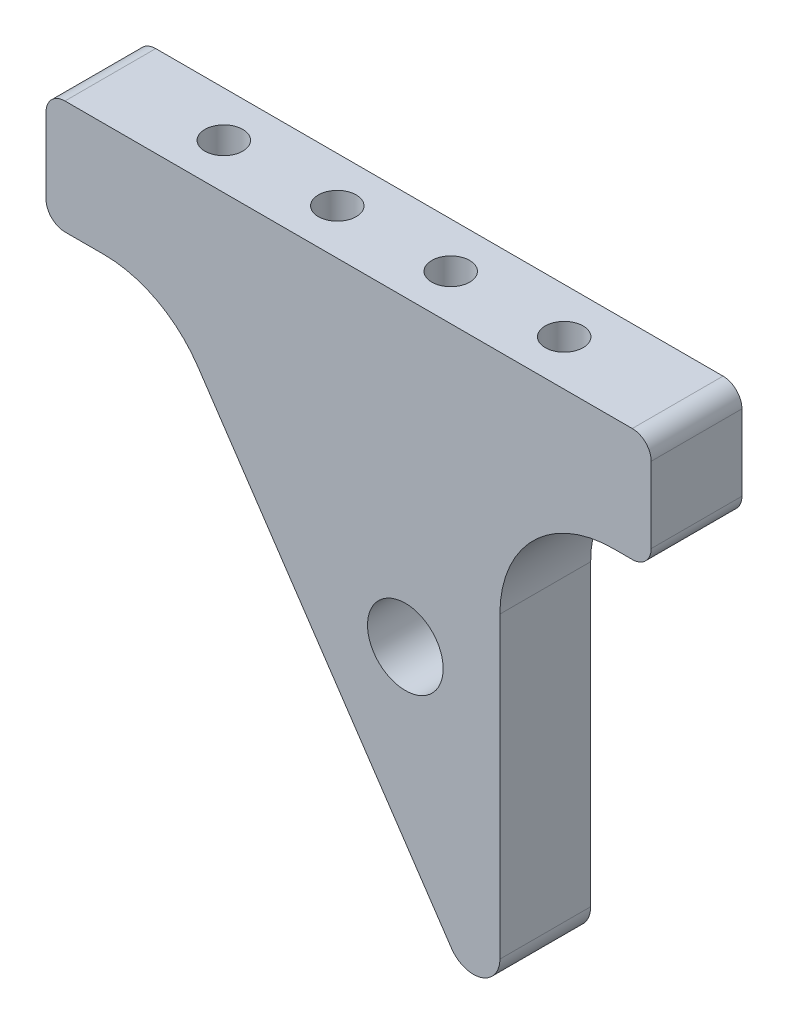
ISO-10303-21;
HEADER;
FILE_DESCRIPTION(('STEP AP214'),'2;1');
FILE_NAME('part.step','',(''),(''),'','','');
FILE_SCHEMA(('AUTOMOTIVE_DESIGN { 1 0 10303 214 1 1 1 1 }'));
ENDSEC;
DATA;
#1=APPLICATION_CONTEXT('core data for automotive mechanical design processes');
#2=APPLICATION_PROTOCOL_DEFINITION('international standard','automotive_design',2000,#1);
#3=PRODUCT_CONTEXT('',#1,'mechanical');
#4=PRODUCT('Part','Part','',(#3));
#5=PRODUCT_RELATED_PRODUCT_CATEGORY('part','',(#4));
#6=PRODUCT_DEFINITION_FORMATION('','',#4);
#7=PRODUCT_DEFINITION_CONTEXT('part definition',#1,'design');
#8=PRODUCT_DEFINITION('design','',#6,#7);
#9=PRODUCT_DEFINITION_SHAPE('','',#8);
#10=(LENGTH_UNIT() NAMED_UNIT(*) SI_UNIT(.MILLI.,.METRE.));
#11=(NAMED_UNIT(*) PLANE_ANGLE_UNIT() SI_UNIT($,.RADIAN.));
#12=(NAMED_UNIT(*) SI_UNIT($,.STERADIAN.) SOLID_ANGLE_UNIT());
#13=UNCERTAINTY_MEASURE_WITH_UNIT(LENGTH_MEASURE(1.E-05),#10,'distance_accuracy_value','');
#14=(GEOMETRIC_REPRESENTATION_CONTEXT(3) GLOBAL_UNCERTAINTY_ASSIGNED_CONTEXT((#13)) GLOBAL_UNIT_ASSIGNED_CONTEXT((#10,
#11,#12)) REPRESENTATION_CONTEXT('',''));
#15=CARTESIAN_POINT('',(0.,0.,0.));
#16=DIRECTION('',(0.,0.,1.));
#17=DIRECTION('',(1.,0.,0.));
#18=AXIS2_PLACEMENT_3D('',#15,#16,#17);
#19=CARTESIAN_POINT('',(27.5,9.99999999999991,12.));
#20=DIRECTION('',(0.,0.,1.));
#21=DIRECTION('',(1.,0.,0.));
#22=AXIS2_PLACEMENT_3D('',#19,#20,#21);
#23=PLANE('',#22);
#24=DIRECTION('',(0.,1.,0.));
#25=VECTOR('',#24,1.);
#26=CARTESIAN_POINT('',(12.5,0.,12.));
#27=LINE('',#26,#25);
#28=CARTESIAN_POINT('',(12.5,-29.5,12.));
#29=VERTEX_POINT('',#28);
#30=CARTESIAN_POINT('',(12.5,9.99999999999981,12.));
#31=VERTEX_POINT('',#30);
#32=EDGE_CURVE('E50',#29,#31,#27,.T.);
#33=ORIENTED_EDGE('',*,*,#32,.T.);
#34=CARTESIAN_POINT('',(27.5,9.99999999999991,12.));
#35=DIRECTION('',(0.,0.,-1.));
#36=DIRECTION('',(1.,0.,0.));
#37=AXIS2_PLACEMENT_3D('',#34,#35,#36);
#38=CIRCLE('',#37,15.);
#39=CARTESIAN_POINT('',(27.5000000000001,24.9999999999999,12.));
#40=VERTEX_POINT('',#39);
#41=EDGE_CURVE('E111',#31,#40,#38,.T.);
#42=ORIENTED_EDGE('',*,*,#41,.T.);
#43=DIRECTION('',(1.,0.,0.));
#44=VECTOR('',#43,1.);
#45=CARTESIAN_POINT('',(30.,24.9999999999999,12.));
#46=LINE('',#45,#44);
#47=CARTESIAN_POINT('',(30.,24.9999999999999,12.));
#48=VERTEX_POINT('',#47);
#49=EDGE_CURVE('E228',#40,#48,#46,.T.);
#50=ORIENTED_EDGE('',*,*,#49,.T.);
#51=CARTESIAN_POINT('',(30.,27.4999999999999,12.));
#52=DIRECTION('',(0.,0.,1.));
#53=DIRECTION('',(-1.,0.,0.));
#54=AXIS2_PLACEMENT_3D('',#51,#52,#53);
#55=CIRCLE('',#54,2.5);
#56=CARTESIAN_POINT('',(32.5,27.4999999999999,12.));
#57=VERTEX_POINT('',#56);
#58=EDGE_CURVE('E248',#48,#57,#55,.T.);
#59=ORIENTED_EDGE('',*,*,#58,.T.);
#60=DIRECTION('',(0.,1.,0.));
#61=VECTOR('',#60,1.);
#62=CARTESIAN_POINT('',(32.5,37.4999999999999,12.));
#63=LINE('',#62,#61);
#64=CARTESIAN_POINT('',(32.5,37.4999999999999,12.));
#65=VERTEX_POINT('',#64);
#66=EDGE_CURVE('E245',#57,#65,#63,.T.);
#67=ORIENTED_EDGE('',*,*,#66,.T.);
#68=CARTESIAN_POINT('',(30.,37.4999999999999,12.));
#69=DIRECTION('',(0.,0.,1.));
#70=DIRECTION('',(-1.,0.,0.));
#71=AXIS2_PLACEMENT_3D('',#68,#69,#70);
#72=CIRCLE('',#71,2.5);
#73=CARTESIAN_POINT('',(30.,39.9999999999999,12.));
#74=VERTEX_POINT('',#73);
#75=EDGE_CURVE('E247',#65,#74,#72,.T.);
#76=ORIENTED_EDGE('',*,*,#75,.T.);
#77=DIRECTION('',(-1.,0.,0.));
#78=VECTOR('',#77,1.);
#79=CARTESIAN_POINT('',(-45.,39.9999999999999,12.));
#80=LINE('',#79,#78);
#81=CARTESIAN_POINT('',(-45.,39.9999999999999,12.));
#82=VERTEX_POINT('',#81);
#83=EDGE_CURVE('E250',#74,#82,#80,.T.);
#84=ORIENTED_EDGE('',*,*,#83,.T.);
#85=CARTESIAN_POINT('',(-45.,37.4999999999999,12.));
#86=DIRECTION('',(0.,0.,1.));
#87=DIRECTION('',(1.,0.,0.));
#88=AXIS2_PLACEMENT_3D('',#85,#86,#87);
#89=CIRCLE('',#88,2.50000000000001);
#90=CARTESIAN_POINT('',(-47.5,37.4999999999999,12.));
#91=VERTEX_POINT('',#90);
#92=EDGE_CURVE('E256',#82,#91,#89,.T.);
#93=ORIENTED_EDGE('',*,*,#92,.T.);
#94=DIRECTION('',(0.,-1.,0.));
#95=VECTOR('',#94,1.);
#96=CARTESIAN_POINT('',(-47.5,27.4999999999999,12.));
#97=LINE('',#96,#95);
#98=CARTESIAN_POINT('',(-47.5,27.4999999999999,12.));
#99=VERTEX_POINT('',#98);
#100=EDGE_CURVE('E258',#91,#99,#97,.T.);
#101=ORIENTED_EDGE('',*,*,#100,.T.);
#102=CARTESIAN_POINT('',(-45.,27.4999999999999,12.));
#103=DIRECTION('',(0.,0.,1.));
#104=DIRECTION('',(-1.,0.,0.));
#105=AXIS2_PLACEMENT_3D('',#102,#103,#104);
#106=CIRCLE('',#105,2.5);
#107=CARTESIAN_POINT('',(-45.,24.9999999999999,12.));
#108=VERTEX_POINT('',#107);
#109=EDGE_CURVE('E260',#99,#108,#106,.T.);
#110=ORIENTED_EDGE('',*,*,#109,.T.);
#111=DIRECTION('',(1.,0.,0.));
#112=VECTOR('',#111,1.);
#113=CARTESIAN_POINT('',(-39.8725055432373,24.9999999999999,12.));
#114=LINE('',#113,#112);
#115=CARTESIAN_POINT('',(-39.8725055432373,24.9999999999999,12.));
#116=VERTEX_POINT('',#115);
#117=EDGE_CURVE('E149',#108,#116,#114,.T.);
#118=ORIENTED_EDGE('',*,*,#117,.T.);
#119=CARTESIAN_POINT('',(-39.8725055432372,9.99999999999991,12.));
#120=DIRECTION('',(0.,0.,-1.));
#121=DIRECTION('',(-1.,0.,0.));
#122=AXIS2_PLACEMENT_3D('',#119,#120,#121);
#123=CIRCLE('',#122,15.);
#124=CARTESIAN_POINT('',(-27.4270390517785,18.3731931668855,12.));
#125=VERTEX_POINT('',#124);
#126=EDGE_CURVE('E143',#116,#125,#123,.T.);
#127=ORIENTED_EDGE('',*,*,#126,.T.);
#128=DIRECTION('',(0.558212877792378,-0.82969776609724,0.));
#129=VECTOR('',#128,1.);
#130=CARTESIAN_POINT('',(-27.4270390517785,18.3731931668855,12.));
#131=LINE('',#130,#129);
#132=CARTESIAN_POINT('',(6.09605781865966,-31.4537450722733,12.));
#133=VERTEX_POINT('',#132);
#134=EDGE_CURVE('E147',#125,#133,#131,.T.);
#135=ORIENTED_EDGE('',*,*,#134,.T.);
#136=CARTESIAN_POINT('',(9.00000000000001,-29.5,12.));
#137=DIRECTION('',(0.,0.,1.));
#138=DIRECTION('',(-1.,0.,0.));
#139=AXIS2_PLACEMENT_3D('',#136,#137,#138);
#140=CIRCLE('',#139,3.5);
#141=EDGE_CURVE('E164',#133,#29,#140,.T.);
#142=ORIENTED_EDGE('',*,*,#141,.T.);
#143=EDGE_LOOP('',(#33,#42,#50,#59,#67,#76,#84,#93,#101,#110,#118,#127,#135,#142));
#144=FACE_BOUND('',#143,.T.);
#145=CARTESIAN_POINT('',(0.,0.,12.));
#146=DIRECTION('',(0.,0.,1.));
#147=DIRECTION('',(1.,0.,0.));
#148=AXIS2_PLACEMENT_3D('',#145,#146,#147);
#149=CIRCLE('',#148,5.);
#150=CARTESIAN_POINT('',(5.,0.,12.));
#151=VERTEX_POINT('',#150);
#152=EDGE_CURVE('E173',#151,#151,#149,.T.);
#153=ORIENTED_EDGE('',*,*,#152,.F.);
#154=EDGE_LOOP('',(#153));
#155=FACE_BOUND('',#154,.T.);
#156=ADVANCED_FACE('F33',(#144,#155),#23,.T.);
#157=CARTESIAN_POINT('',(27.5,9.99999999999991,0.));
#158=DIRECTION('',(0.,0.,1.));
#159=DIRECTION('',(1.,0.,0.));
#160=AXIS2_PLACEMENT_3D('',#157,#158,#159);
#161=PLANE('',#160);
#162=CARTESIAN_POINT('',(27.5,9.99999999999991,0.));
#163=DIRECTION('',(0.,0.,-1.));
#164=DIRECTION('',(1.,0.,0.));
#165=AXIS2_PLACEMENT_3D('',#162,#163,#164);
#166=CIRCLE('',#165,15.);
#167=CARTESIAN_POINT('',(12.5,9.99999999999981,0.));
#168=VERTEX_POINT('',#167);
#169=CARTESIAN_POINT('',(27.5000000000001,24.9999999999999,0.));
#170=VERTEX_POINT('',#169);
#171=EDGE_CURVE('E170',#168,#170,#166,.T.);
#172=ORIENTED_EDGE('',*,*,#171,.F.);
#173=DIRECTION('',(0.,1.,0.));
#174=VECTOR('',#173,1.);
#175=CARTESIAN_POINT('',(12.5,0.,0.));
#176=LINE('',#175,#174);
#177=CARTESIAN_POINT('',(12.5,-29.5,0.));
#178=VERTEX_POINT('',#177);
#179=EDGE_CURVE('E194',#178,#168,#176,.T.);
#180=ORIENTED_EDGE('',*,*,#179,.F.);
#181=CARTESIAN_POINT('',(9.00000000000001,-29.5,0.));
#182=DIRECTION('',(0.,0.,1.));
#183=DIRECTION('',(-1.,0.,0.));
#184=AXIS2_PLACEMENT_3D('',#181,#182,#183);
#185=CIRCLE('',#184,3.5);
#186=CARTESIAN_POINT('',(6.09605781865966,-31.4537450722733,0.));
#187=VERTEX_POINT('',#186);
#188=EDGE_CURVE('E104',#187,#178,#185,.T.);
#189=ORIENTED_EDGE('',*,*,#188,.F.);
#190=DIRECTION('',(0.558212877792379,-0.82969776609724,0.));
#191=VECTOR('',#190,1.);
#192=CARTESIAN_POINT('',(-10.3712220762155,-6.97766097240473,0.));
#193=LINE('',#192,#191);
#194=CARTESIAN_POINT('',(-27.4270390517785,18.3731931668855,0.));
#195=VERTEX_POINT('',#194);
#196=EDGE_CURVE('E97',#195,#187,#193,.T.);
#197=ORIENTED_EDGE('',*,*,#196,.F.);
#198=CARTESIAN_POINT('',(-39.8725055432372,9.99999999999991,0.));
#199=DIRECTION('',(0.,0.,-1.));
#200=DIRECTION('',(-1.,0.,0.));
#201=AXIS2_PLACEMENT_3D('',#198,#199,#200);
#202=CIRCLE('',#201,15.);
#203=CARTESIAN_POINT('',(-39.8725055432373,24.9999999999999,0.));
#204=VERTEX_POINT('',#203);
#205=EDGE_CURVE('E158',#204,#195,#202,.T.);
#206=ORIENTED_EDGE('',*,*,#205,.F.);
#207=DIRECTION('',(1.,0.,0.));
#208=VECTOR('',#207,1.);
#209=CARTESIAN_POINT('',(-39.8725055432373,24.9999999999999,0.));
#210=LINE('',#209,#208);
#211=CARTESIAN_POINT('',(-45.,24.9999999999999,0.));
#212=VERTEX_POINT('',#211);
#213=EDGE_CURVE('E189',#212,#204,#210,.T.);
#214=ORIENTED_EDGE('',*,*,#213,.F.);
#215=CARTESIAN_POINT('',(-45.,27.4999999999999,0.));
#216=DIRECTION('',(0.,0.,1.));
#217=DIRECTION('',(-1.,0.,0.));
#218=AXIS2_PLACEMENT_3D('',#215,#216,#217);
#219=CIRCLE('',#218,2.5);
#220=CARTESIAN_POINT('',(-47.5,27.4999999999999,0.));
#221=VERTEX_POINT('',#220);
#222=EDGE_CURVE('E187',#221,#212,#219,.T.);
#223=ORIENTED_EDGE('',*,*,#222,.F.);
#224=DIRECTION('',(0.,-1.,0.));
#225=VECTOR('',#224,1.);
#226=CARTESIAN_POINT('',(-47.5,27.4999999999999,0.));
#227=LINE('',#226,#225);
#228=CARTESIAN_POINT('',(-47.5,37.4999999999999,0.));
#229=VERTEX_POINT('',#228);
#230=EDGE_CURVE('E185',#229,#221,#227,.T.);
#231=ORIENTED_EDGE('',*,*,#230,.F.);
#232=CARTESIAN_POINT('',(-45.,37.4999999999999,0.));
#233=DIRECTION('',(0.,0.,1.));
#234=DIRECTION('',(1.,0.,0.));
#235=AXIS2_PLACEMENT_3D('',#232,#233,#234);
#236=CIRCLE('',#235,2.50000000000001);
#237=CARTESIAN_POINT('',(-45.,39.9999999999999,0.));
#238=VERTEX_POINT('',#237);
#239=EDGE_CURVE('E183',#238,#229,#236,.T.);
#240=ORIENTED_EDGE('',*,*,#239,.F.);
#241=DIRECTION('',(-1.,0.,0.));
#242=VECTOR('',#241,1.);
#243=CARTESIAN_POINT('',(-45.,39.9999999999999,0.));
#244=LINE('',#243,#242);
#245=CARTESIAN_POINT('',(30.,39.9999999999999,0.));
#246=VERTEX_POINT('',#245);
#247=EDGE_CURVE('E181',#246,#238,#244,.T.);
#248=ORIENTED_EDGE('',*,*,#247,.F.);
#249=CARTESIAN_POINT('',(30.,37.4999999999999,0.));
#250=DIRECTION('',(0.,0.,1.));
#251=DIRECTION('',(-1.,0.,0.));
#252=AXIS2_PLACEMENT_3D('',#249,#250,#251);
#253=CIRCLE('',#252,2.5);
#254=CARTESIAN_POINT('',(32.5,37.4999999999999,0.));
#255=VERTEX_POINT('',#254);
#256=EDGE_CURVE('E179',#255,#246,#253,.T.);
#257=ORIENTED_EDGE('',*,*,#256,.F.);
#258=DIRECTION('',(0.,1.,0.));
#259=VECTOR('',#258,1.);
#260=CARTESIAN_POINT('',(32.5,37.4999999999999,0.));
#261=LINE('',#260,#259);
#262=CARTESIAN_POINT('',(32.5,27.4999999999999,0.));
#263=VERTEX_POINT('',#262);
#264=EDGE_CURVE('E177',#263,#255,#261,.T.);
#265=ORIENTED_EDGE('',*,*,#264,.F.);
#266=CARTESIAN_POINT('',(30.,27.4999999999999,0.));
#267=DIRECTION('',(0.,0.,1.));
#268=DIRECTION('',(-1.,0.,0.));
#269=AXIS2_PLACEMENT_3D('',#266,#267,#268);
#270=CIRCLE('',#269,2.5);
#271=CARTESIAN_POINT('',(30.,24.9999999999999,0.));
#272=VERTEX_POINT('',#271);
#273=EDGE_CURVE('E175',#272,#263,#270,.T.);
#274=ORIENTED_EDGE('',*,*,#273,.F.);
#275=DIRECTION('',(1.,0.,0.));
#276=VECTOR('',#275,1.);
#277=CARTESIAN_POINT('',(30.,24.9999999999999,0.));
#278=LINE('',#277,#276);
#279=EDGE_CURVE('E172',#170,#272,#278,.T.);
#280=ORIENTED_EDGE('',*,*,#279,.F.);
#281=EDGE_LOOP('',(#172,#180,#189,#197,#206,#214,#223,#231,#240,#248,#257,#265,#274,#280));
#282=FACE_BOUND('',#281,.T.);
#283=CARTESIAN_POINT('',(0.,0.,0.));
#284=DIRECTION('',(0.,0.,1.));
#285=DIRECTION('',(1.,0.,0.));
#286=AXIS2_PLACEMENT_3D('',#283,#284,#285);
#287=CIRCLE('',#286,5.);
#288=CARTESIAN_POINT('',(5.,0.,0.));
#289=VERTEX_POINT('',#288);
#290=EDGE_CURVE('E276',#289,#289,#287,.T.);
#291=ORIENTED_EDGE('',*,*,#290,.T.);
#292=EDGE_LOOP('',(#291));
#293=FACE_BOUND('',#292,.T.);
#294=ADVANCED_FACE('F232',(#282,#293),#161,.F.);
#295=CARTESIAN_POINT('',(27.5,9.99999999999991,12.));
#296=DIRECTION('',(0.,0.,-1.));
#297=DIRECTION('',(-1.,0.,0.));
#298=AXIS2_PLACEMENT_3D('',#295,#296,#297);
#299=CYLINDRICAL_SURFACE('',#298,15.);
#300=ORIENTED_EDGE('',*,*,#171,.T.);
#301=DIRECTION('',(0.,0.,-1.));
#302=VECTOR('',#301,1.);
#303=CARTESIAN_POINT('',(27.5000000000001,24.9999999999999,12.));
#304=LINE('',#303,#302);
#305=EDGE_CURVE('E42',#40,#170,#304,.T.);
#306=ORIENTED_EDGE('',*,*,#305,.F.);
#307=ORIENTED_EDGE('',*,*,#41,.F.);
#308=DIRECTION('',(0.,0.,-1.));
#309=VECTOR('',#308,1.);
#310=CARTESIAN_POINT('',(12.5,9.99999999999981,12.));
#311=LINE('',#310,#309);
#312=EDGE_CURVE('E11',#31,#168,#311,.T.);
#313=ORIENTED_EDGE('',*,*,#312,.T.);
#314=EDGE_LOOP('',(#300,#306,#307,#313));
#315=FACE_BOUND('',#314,.T.);
#316=ADVANCED_FACE('F35',(#315),#299,.F.);
#317=CARTESIAN_POINT('',(30.,24.9999999999999,12.));
#318=DIRECTION('',(0.,1.,0.));
#319=DIRECTION('',(0.,0.,1.));
#320=AXIS2_PLACEMENT_3D('',#317,#318,#319);
#321=PLANE('',#320);
#322=ORIENTED_EDGE('',*,*,#279,.T.);
#323=DIRECTION('',(0.,0.,-1.));
#324=VECTOR('',#323,1.);
#325=CARTESIAN_POINT('',(30.,24.9999999999999,12.));
#326=LINE('',#325,#324);
#327=EDGE_CURVE('E220',#48,#272,#326,.T.);
#328=ORIENTED_EDGE('',*,*,#327,.F.);
#329=ORIENTED_EDGE('',*,*,#49,.F.);
#330=ORIENTED_EDGE('',*,*,#305,.T.);
#331=EDGE_LOOP('',(#322,#328,#329,#330));
#332=FACE_BOUND('',#331,.T.);
#333=ADVANCED_FACE('F226',(#332),#321,.F.);
#334=CARTESIAN_POINT('',(30.,27.4999999999999,12.));
#335=DIRECTION('',(0.,0.,-1.));
#336=DIRECTION('',(-1.,0.,0.));
#337=AXIS2_PLACEMENT_3D('',#334,#335,#336);
#338=CYLINDRICAL_SURFACE('',#337,2.5);
#339=ORIENTED_EDGE('',*,*,#273,.T.);
#340=DIRECTION('',(0.,0.,-1.));
#341=VECTOR('',#340,1.);
#342=CARTESIAN_POINT('',(32.5,27.4999999999999,12.));
#343=LINE('',#342,#341);
#344=EDGE_CURVE('E217',#57,#263,#343,.T.);
#345=ORIENTED_EDGE('',*,*,#344,.F.);
#346=ORIENTED_EDGE('',*,*,#58,.F.);
#347=ORIENTED_EDGE('',*,*,#327,.T.);
#348=EDGE_LOOP('',(#339,#345,#346,#347));
#349=FACE_BOUND('',#348,.T.);
#350=ADVANCED_FACE('F239',(#349),#338,.T.);
#351=CARTESIAN_POINT('',(32.5,37.4999999999999,12.));
#352=DIRECTION('',(-1.,0.,0.));
#353=DIRECTION('',(0.,0.,1.));
#354=AXIS2_PLACEMENT_3D('',#351,#352,#353);
#355=PLANE('',#354);
#356=ORIENTED_EDGE('',*,*,#264,.T.);
#357=DIRECTION('',(0.,0.,-1.));
#358=VECTOR('',#357,1.);
#359=CARTESIAN_POINT('',(32.5,37.4999999999999,12.));
#360=LINE('',#359,#358);
#361=EDGE_CURVE('E214',#65,#255,#360,.T.);
#362=ORIENTED_EDGE('',*,*,#361,.F.);
#363=ORIENTED_EDGE('',*,*,#66,.F.);
#364=ORIENTED_EDGE('',*,*,#344,.T.);
#365=EDGE_LOOP('',(#356,#362,#363,#364));
#366=FACE_BOUND('',#365,.T.);
#367=ADVANCED_FACE('F243',(#366),#355,.F.);
#368=CARTESIAN_POINT('',(30.,37.4999999999999,12.));
#369=DIRECTION('',(0.,0.,-1.));
#370=DIRECTION('',(-1.,0.,0.));
#371=AXIS2_PLACEMENT_3D('',#368,#369,#370);
#372=CYLINDRICAL_SURFACE('',#371,2.5);
#373=ORIENTED_EDGE('',*,*,#256,.T.);
#374=DIRECTION('',(0.,0.,-1.));
#375=VECTOR('',#374,1.);
#376=CARTESIAN_POINT('',(30.,39.9999999999999,12.));
#377=LINE('',#376,#375);
#378=EDGE_CURVE('E211',#74,#246,#377,.T.);
#379=ORIENTED_EDGE('',*,*,#378,.F.);
#380=ORIENTED_EDGE('',*,*,#75,.F.);
#381=ORIENTED_EDGE('',*,*,#361,.T.);
#382=EDGE_LOOP('',(#373,#379,#380,#381));
#383=FACE_BOUND('',#382,.T.);
#384=ADVANCED_FACE('F319',(#383),#372,.T.);
#385=CARTESIAN_POINT('',(-45.,39.9999999999999,12.));
#386=DIRECTION('',(0.,-1.,0.));
#387=DIRECTION('',(0.,0.,-1.));
#388=AXIS2_PLACEMENT_3D('',#385,#386,#387);
#389=PLANE('',#388);
#390=CARTESIAN_POINT('',(-30.,39.9999999999999,6.));
#391=DIRECTION('',(0.,1.,0.));
#392=DIRECTION('',(0.,0.,1.));
#393=AXIS2_PLACEMENT_3D('',#390,#391,#392);
#394=CIRCLE('',#393,2.5);
#395=CARTESIAN_POINT('',(-30.,39.9999999999999,8.5));
#396=VERTEX_POINT('',#395);
#397=EDGE_CURVE('E300',#396,#396,#394,.T.);
#398=ORIENTED_EDGE('',*,*,#397,.F.);
#399=EDGE_LOOP('',(#398));
#400=FACE_BOUND('',#399,.T.);
#401=CARTESIAN_POINT('',(-15.,39.9999999999999,6.));
#402=DIRECTION('',(0.,1.,0.));
#403=DIRECTION('',(0.,0.,1.));
#404=AXIS2_PLACEMENT_3D('',#401,#402,#403);
#405=CIRCLE('',#404,2.5);
#406=CARTESIAN_POINT('',(-15.,39.9999999999999,8.5));
#407=VERTEX_POINT('',#406);
#408=EDGE_CURVE('E294',#407,#407,#405,.T.);
#409=ORIENTED_EDGE('',*,*,#408,.F.);
#410=EDGE_LOOP('',(#409));
#411=FACE_BOUND('',#410,.T.);
#412=CARTESIAN_POINT('',(0.,39.9999999999999,6.));
#413=DIRECTION('',(0.,1.,0.));
#414=DIRECTION('',(0.,0.,1.));
#415=AXIS2_PLACEMENT_3D('',#412,#413,#414);
#416=CIRCLE('',#415,2.5);
#417=CARTESIAN_POINT('',(0.,39.9999999999999,8.5));
#418=VERTEX_POINT('',#417);
#419=EDGE_CURVE('E288',#418,#418,#416,.T.);
#420=ORIENTED_EDGE('',*,*,#419,.F.);
#421=EDGE_LOOP('',(#420));
#422=FACE_BOUND('',#421,.T.);
#423=CARTESIAN_POINT('',(15.,39.9999999999999,6.));
#424=DIRECTION('',(0.,1.,0.));
#425=DIRECTION('',(0.,0.,1.));
#426=AXIS2_PLACEMENT_3D('',#423,#424,#425);
#427=CIRCLE('',#426,2.5);
#428=CARTESIAN_POINT('',(15.,39.9999999999999,8.5));
#429=VERTEX_POINT('',#428);
#430=EDGE_CURVE('E282',#429,#429,#427,.T.);
#431=ORIENTED_EDGE('',*,*,#430,.F.);
#432=EDGE_LOOP('',(#431));
#433=FACE_BOUND('',#432,.T.);
#434=ORIENTED_EDGE('',*,*,#247,.T.);
#435=DIRECTION('',(0.,0.,-1.));
#436=VECTOR('',#435,1.);
#437=CARTESIAN_POINT('',(-45.,39.9999999999999,12.));
#438=LINE('',#437,#436);
#439=EDGE_CURVE('E208',#82,#238,#438,.T.);
#440=ORIENTED_EDGE('',*,*,#439,.F.);
#441=ORIENTED_EDGE('',*,*,#83,.F.);
#442=ORIENTED_EDGE('',*,*,#378,.T.);
#443=EDGE_LOOP('',(#434,#440,#441,#442));
#444=FACE_BOUND('',#443,.T.);
#445=ADVANCED_FACE('F315',(#400,#411,#422,#433,#444),#389,.F.);
#446=CARTESIAN_POINT('',(-45.,37.4999999999999,12.));
#447=DIRECTION('',(0.,0.,-1.));
#448=DIRECTION('',(-1.,0.,0.));
#449=AXIS2_PLACEMENT_3D('',#446,#447,#448);
#450=CYLINDRICAL_SURFACE('',#449,2.50000000000001);
#451=ORIENTED_EDGE('',*,*,#239,.T.);
#452=DIRECTION('',(0.,0.,-1.));
#453=VECTOR('',#452,1.);
#454=CARTESIAN_POINT('',(-47.5,37.4999999999999,12.));
#455=LINE('',#454,#453);
#456=EDGE_CURVE('E205',#91,#229,#455,.T.);
#457=ORIENTED_EDGE('',*,*,#456,.F.);
#458=ORIENTED_EDGE('',*,*,#92,.F.);
#459=ORIENTED_EDGE('',*,*,#439,.T.);
#460=EDGE_LOOP('',(#451,#457,#458,#459));
#461=FACE_BOUND('',#460,.T.);
#462=ADVANCED_FACE('F318',(#461),#450,.T.);
#463=CARTESIAN_POINT('',(-47.5,27.4999999999999,12.));
#464=DIRECTION('',(1.,0.,0.));
#465=DIRECTION('',(0.,0.,-1.));
#466=AXIS2_PLACEMENT_3D('',#463,#464,#465);
#467=PLANE('',#466);
#468=ORIENTED_EDGE('',*,*,#230,.T.);
#469=DIRECTION('',(0.,0.,-1.));
#470=VECTOR('',#469,1.);
#471=CARTESIAN_POINT('',(-47.5,27.4999999999999,12.));
#472=LINE('',#471,#470);
#473=EDGE_CURVE('E202',#99,#221,#472,.T.);
#474=ORIENTED_EDGE('',*,*,#473,.F.);
#475=ORIENTED_EDGE('',*,*,#100,.F.);
#476=ORIENTED_EDGE('',*,*,#456,.T.);
#477=EDGE_LOOP('',(#468,#474,#475,#476));
#478=FACE_BOUND('',#477,.T.);
#479=ADVANCED_FACE('F337',(#478),#467,.F.);
#480=CARTESIAN_POINT('',(-45.,27.4999999999999,12.));
#481=DIRECTION('',(0.,0.,-1.));
#482=DIRECTION('',(-1.,0.,0.));
#483=AXIS2_PLACEMENT_3D('',#480,#481,#482);
#484=CYLINDRICAL_SURFACE('',#483,2.5);
#485=ORIENTED_EDGE('',*,*,#222,.T.);
#486=DIRECTION('',(0.,0.,-1.));
#487=VECTOR('',#486,1.);
#488=CARTESIAN_POINT('',(-45.,24.9999999999999,12.));
#489=LINE('',#488,#487);
#490=EDGE_CURVE('E199',#108,#212,#489,.T.);
#491=ORIENTED_EDGE('',*,*,#490,.F.);
#492=ORIENTED_EDGE('',*,*,#109,.F.);
#493=ORIENTED_EDGE('',*,*,#473,.T.);
#494=EDGE_LOOP('',(#485,#491,#492,#493));
#495=FACE_BOUND('',#494,.T.);
#496=ADVANCED_FACE('F266',(#495),#484,.T.);
#497=CARTESIAN_POINT('',(-39.8725055432373,24.9999999999999,12.));
#498=DIRECTION('',(0.,1.,0.));
#499=DIRECTION('',(0.,0.,1.));
#500=AXIS2_PLACEMENT_3D('',#497,#498,#499);
#501=PLANE('',#500);
#502=ORIENTED_EDGE('',*,*,#213,.T.);
#503=DIRECTION('',(0.,0.,-1.));
#504=VECTOR('',#503,1.);
#505=CARTESIAN_POINT('',(-39.8725055432373,24.9999999999999,12.));
#506=LINE('',#505,#504);
#507=EDGE_CURVE('E159',#116,#204,#506,.T.);
#508=ORIENTED_EDGE('',*,*,#507,.F.);
#509=ORIENTED_EDGE('',*,*,#117,.F.);
#510=ORIENTED_EDGE('',*,*,#490,.T.);
#511=EDGE_LOOP('',(#502,#508,#509,#510));
#512=FACE_BOUND('',#511,.T.);
#513=ADVANCED_FACE('F270',(#512),#501,.F.);
#514=CARTESIAN_POINT('',(-39.8725055432372,9.99999999999991,12.));
#515=DIRECTION('',(0.,0.,-1.));
#516=DIRECTION('',(-1.,0.,0.));
#517=AXIS2_PLACEMENT_3D('',#514,#515,#516);
#518=CYLINDRICAL_SURFACE('',#517,15.);
#519=ORIENTED_EDGE('',*,*,#205,.T.);
#520=DIRECTION('',(0.,0.,-1.));
#521=VECTOR('',#520,1.);
#522=CARTESIAN_POINT('',(-27.4270390517785,18.3731931668855,12.));
#523=LINE('',#522,#521);
#524=EDGE_CURVE('E155',#125,#195,#523,.T.);
#525=ORIENTED_EDGE('',*,*,#524,.F.);
#526=ORIENTED_EDGE('',*,*,#126,.F.);
#527=ORIENTED_EDGE('',*,*,#507,.T.);
#528=EDGE_LOOP('',(#519,#525,#526,#527));
#529=FACE_BOUND('',#528,.T.);
#530=ADVANCED_FACE('F156',(#529),#518,.F.);
#531=CARTESIAN_POINT('',(-10.3712220762155,-6.97766097240473,12.));
#532=DIRECTION('',(0.82969776609724,0.558212877792378,0.));
#533=DIRECTION('',(-0.558212877792379,0.829697766097241,0.));
#534=AXIS2_PLACEMENT_3D('',#531,#532,#533);
#535=PLANE('',#534);
#536=ORIENTED_EDGE('',*,*,#196,.T.);
#537=DIRECTION('',(0.,0.,-1.));
#538=VECTOR('',#537,1.);
#539=CARTESIAN_POINT('',(6.09605781865966,-31.4537450722733,12.));
#540=LINE('',#539,#538);
#541=EDGE_CURVE('E160',#133,#187,#540,.T.);
#542=ORIENTED_EDGE('',*,*,#541,.F.);
#543=ORIENTED_EDGE('',*,*,#134,.F.);
#544=ORIENTED_EDGE('',*,*,#524,.T.);
#545=EDGE_LOOP('',(#536,#542,#543,#544));
#546=FACE_BOUND('',#545,.T.);
#547=ADVANCED_FACE('F162',(#546),#535,.F.);
#548=CARTESIAN_POINT('',(9.00000000000001,-29.5,12.));
#549=DIRECTION('',(0.,0.,-1.));
#550=DIRECTION('',(-1.,0.,0.));
#551=AXIS2_PLACEMENT_3D('',#548,#549,#550);
#552=CYLINDRICAL_SURFACE('',#551,3.5);
#553=ORIENTED_EDGE('',*,*,#188,.T.);
#554=DIRECTION('',(0.,0.,-1.));
#555=VECTOR('',#554,1.);
#556=CARTESIAN_POINT('',(12.5,-29.5,12.));
#557=LINE('',#556,#555);
#558=EDGE_CURVE('E166',#29,#178,#557,.T.);
#559=ORIENTED_EDGE('',*,*,#558,.F.);
#560=ORIENTED_EDGE('',*,*,#141,.F.);
#561=ORIENTED_EDGE('',*,*,#541,.T.);
#562=EDGE_LOOP('',(#553,#559,#560,#561));
#563=FACE_BOUND('',#562,.T.);
#564=ADVANCED_FACE('F272',(#563),#552,.T.);
#565=CARTESIAN_POINT('',(12.5,0.,12.));
#566=DIRECTION('',(-1.,0.,0.));
#567=DIRECTION('',(0.,-1.,0.));
#568=AXIS2_PLACEMENT_3D('',#565,#566,#567);
#569=PLANE('',#568);
#570=ORIENTED_EDGE('',*,*,#179,.T.);
#571=ORIENTED_EDGE('',*,*,#312,.F.);
#572=ORIENTED_EDGE('',*,*,#32,.F.);
#573=ORIENTED_EDGE('',*,*,#558,.T.);
#574=EDGE_LOOP('',(#570,#571,#572,#573));
#575=FACE_BOUND('',#574,.T.);
#576=ADVANCED_FACE('F271',(#575),#569,.F.);
#577=CARTESIAN_POINT('',(0.,0.,12.));
#578=DIRECTION('',(0.,0.,-1.));
#579=DIRECTION('',(-1.,0.,0.));
#580=AXIS2_PLACEMENT_3D('',#577,#578,#579);
#581=CYLINDRICAL_SURFACE('',#580,5.);
#582=ORIENTED_EDGE('',*,*,#152,.T.);
#583=EDGE_LOOP('',(#582));
#584=FACE_BOUND('',#583,.T.);
#585=ORIENTED_EDGE('',*,*,#290,.F.);
#586=EDGE_LOOP('',(#585));
#587=FACE_BOUND('',#586,.T.);
#588=ADVANCED_FACE('F353',(#584,#587),#581,.F.);
#589=CARTESIAN_POINT('',(15.,29.9999999999999,6.));
#590=DIRECTION('',(0.,1.,0.));
#591=DIRECTION('',(0.,0.,1.));
#592=AXIS2_PLACEMENT_3D('',#589,#590,#591);
#593=CYLINDRICAL_SURFACE('',#592,2.5);
#594=CARTESIAN_POINT('',(15.,29.9999999999999,6.));
#595=DIRECTION('',(0.,1.,0.));
#596=DIRECTION('',(0.,0.,1.));
#597=AXIS2_PLACEMENT_3D('',#594,#595,#596);
#598=CIRCLE('',#597,2.5);
#599=CARTESIAN_POINT('',(15.,29.9999999999999,8.5));
#600=VERTEX_POINT('',#599);
#601=EDGE_CURVE('E285',#600,#600,#598,.T.);
#602=ORIENTED_EDGE('',*,*,#601,.F.);
#603=EDGE_LOOP('',(#602));
#604=FACE_BOUND('',#603,.T.);
#605=ORIENTED_EDGE('',*,*,#430,.T.);
#606=EDGE_LOOP('',(#605));
#607=FACE_BOUND('',#606,.T.);
#608=ADVANCED_FACE('F391',(#604,#607),#593,.F.);
#609=CARTESIAN_POINT('',(15.,29.9999999999999,6.));
#610=DIRECTION('',(0.,1.,0.));
#611=DIRECTION('',(0.,0.,1.));
#612=AXIS2_PLACEMENT_3D('',#609,#610,#611);
#613=PLANE('',#612);
#614=ORIENTED_EDGE('',*,*,#601,.T.);
#615=EDGE_LOOP('',(#614));
#616=FACE_BOUND('',#615,.T.);
#617=ADVANCED_FACE('F399',(#616),#613,.T.);
#618=CARTESIAN_POINT('',(0.,29.9999999999999,6.));
#619=DIRECTION('',(0.,1.,0.));
#620=DIRECTION('',(0.,0.,1.));
#621=AXIS2_PLACEMENT_3D('',#618,#619,#620);
#622=CYLINDRICAL_SURFACE('',#621,2.5);
#623=CARTESIAN_POINT('',(0.,29.9999999999999,6.));
#624=DIRECTION('',(0.,1.,0.));
#625=DIRECTION('',(0.,0.,1.));
#626=AXIS2_PLACEMENT_3D('',#623,#624,#625);
#627=CIRCLE('',#626,2.5);
#628=CARTESIAN_POINT('',(0.,29.9999999999999,8.5));
#629=VERTEX_POINT('',#628);
#630=EDGE_CURVE('E291',#629,#629,#627,.T.);
#631=ORIENTED_EDGE('',*,*,#630,.F.);
#632=EDGE_LOOP('',(#631));
#633=FACE_BOUND('',#632,.T.);
#634=ORIENTED_EDGE('',*,*,#419,.T.);
#635=EDGE_LOOP('',(#634));
#636=FACE_BOUND('',#635,.T.);
#637=ADVANCED_FACE('F406',(#633,#636),#622,.F.);
#638=CARTESIAN_POINT('',(0.,29.9999999999999,6.));
#639=DIRECTION('',(0.,1.,0.));
#640=DIRECTION('',(0.,0.,1.));
#641=AXIS2_PLACEMENT_3D('',#638,#639,#640);
#642=PLANE('',#641);
#643=ORIENTED_EDGE('',*,*,#630,.T.);
#644=EDGE_LOOP('',(#643));
#645=FACE_BOUND('',#644,.T.);
#646=ADVANCED_FACE('F414',(#645),#642,.T.);
#647=CARTESIAN_POINT('',(-15.,29.9999999999999,6.));
#648=DIRECTION('',(0.,1.,0.));
#649=DIRECTION('',(0.,0.,1.));
#650=AXIS2_PLACEMENT_3D('',#647,#648,#649);
#651=CYLINDRICAL_SURFACE('',#650,2.5);
#652=CARTESIAN_POINT('',(-15.,29.9999999999999,6.));
#653=DIRECTION('',(0.,1.,0.));
#654=DIRECTION('',(0.,0.,1.));
#655=AXIS2_PLACEMENT_3D('',#652,#653,#654);
#656=CIRCLE('',#655,2.5);
#657=CARTESIAN_POINT('',(-15.,29.9999999999999,8.5));
#658=VERTEX_POINT('',#657);
#659=EDGE_CURVE('E297',#658,#658,#656,.T.);
#660=ORIENTED_EDGE('',*,*,#659,.F.);
#661=EDGE_LOOP('',(#660));
#662=FACE_BOUND('',#661,.T.);
#663=ORIENTED_EDGE('',*,*,#408,.T.);
#664=EDGE_LOOP('',(#663));
#665=FACE_BOUND('',#664,.T.);
#666=ADVANCED_FACE('F422',(#662,#665),#651,.F.);
#667=CARTESIAN_POINT('',(-15.,29.9999999999999,6.));
#668=DIRECTION('',(0.,1.,0.));
#669=DIRECTION('',(0.,0.,1.));
#670=AXIS2_PLACEMENT_3D('',#667,#668,#669);
#671=PLANE('',#670);
#672=ORIENTED_EDGE('',*,*,#659,.T.);
#673=EDGE_LOOP('',(#672));
#674=FACE_BOUND('',#673,.T.);
#675=ADVANCED_FACE('F311',(#674),#671,.T.);
#676=CARTESIAN_POINT('',(-30.,29.9999999999999,6.));
#677=DIRECTION('',(0.,1.,0.));
#678=DIRECTION('',(0.,0.,1.));
#679=AXIS2_PLACEMENT_3D('',#676,#677,#678);
#680=CYLINDRICAL_SURFACE('',#679,2.5);
#681=CARTESIAN_POINT('',(-30.,29.9999999999999,6.));
#682=DIRECTION('',(0.,1.,0.));
#683=DIRECTION('',(0.,0.,1.));
#684=AXIS2_PLACEMENT_3D('',#681,#682,#683);
#685=CIRCLE('',#684,2.5);
#686=CARTESIAN_POINT('',(-30.,29.9999999999999,8.5));
#687=VERTEX_POINT('',#686);
#688=EDGE_CURVE('E279',#687,#687,#685,.T.);
#689=ORIENTED_EDGE('',*,*,#688,.F.);
#690=EDGE_LOOP('',(#689));
#691=FACE_BOUND('',#690,.T.);
#692=ORIENTED_EDGE('',*,*,#397,.T.);
#693=EDGE_LOOP('',(#692));
#694=FACE_BOUND('',#693,.T.);
#695=ADVANCED_FACE('F308',(#691,#694),#680,.F.);
#696=CARTESIAN_POINT('',(-30.,29.9999999999999,6.));
#697=DIRECTION('',(0.,1.,0.));
#698=DIRECTION('',(0.,0.,1.));
#699=AXIS2_PLACEMENT_3D('',#696,#697,#698);
#700=PLANE('',#699);
#701=ORIENTED_EDGE('',*,*,#688,.T.);
#702=EDGE_LOOP('',(#701));
#703=FACE_BOUND('',#702,.T.);
#704=ADVANCED_FACE('F306',(#703),#700,.T.);
#705=CLOSED_SHELL('',(#156,#294,#316,#333,#350,#367,#384,#445,#462,#479,#496,#513,#530,#547,
#564,#576,#588,#608,#617,#637,#646,#666,#675,#695,#704));
#706=MANIFOLD_SOLID_BREP('B2',#705);
#707=ADVANCED_BREP_SHAPE_REPRESENTATION('',(#18,#706),#14);
#708=SHAPE_DEFINITION_REPRESENTATION(#9,#707);
ENDSEC;
END-ISO-10303-21;
